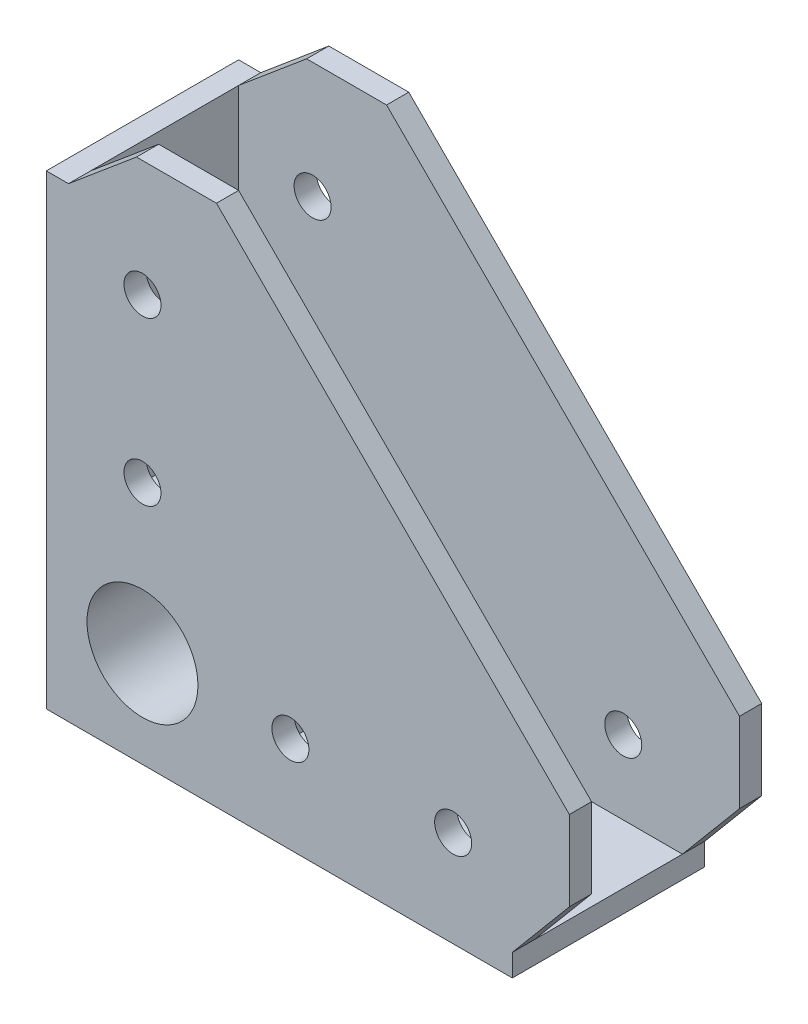
ISO-10303-21;
HEADER;
FILE_DESCRIPTION(('STEP AP214'),'2;1');
FILE_NAME('part.step','',(''),(''),'','','');
FILE_SCHEMA(('AUTOMOTIVE_DESIGN { 1 0 10303 214 1 1 1 1 }'));
ENDSEC;
DATA;
#1=APPLICATION_CONTEXT('core data for automotive mechanical design processes');
#2=APPLICATION_PROTOCOL_DEFINITION('international standard','automotive_design',2000,#1);
#3=PRODUCT_CONTEXT('',#1,'mechanical');
#4=PRODUCT('Part','Part','',(#3));
#5=PRODUCT_RELATED_PRODUCT_CATEGORY('part','',(#4));
#6=PRODUCT_DEFINITION_FORMATION('','',#4);
#7=PRODUCT_DEFINITION_CONTEXT('part definition',#1,'design');
#8=PRODUCT_DEFINITION('design','',#6,#7);
#9=PRODUCT_DEFINITION_SHAPE('','',#8);
#10=(LENGTH_UNIT() NAMED_UNIT(*) SI_UNIT(.MILLI.,.METRE.));
#11=(NAMED_UNIT(*) PLANE_ANGLE_UNIT() SI_UNIT($,.RADIAN.));
#12=(NAMED_UNIT(*) SI_UNIT($,.STERADIAN.) SOLID_ANGLE_UNIT());
#13=UNCERTAINTY_MEASURE_WITH_UNIT(LENGTH_MEASURE(1.E-05),#10,'distance_accuracy_value','');
#14=(GEOMETRIC_REPRESENTATION_CONTEXT(3) GLOBAL_UNCERTAINTY_ASSIGNED_CONTEXT((#13)) GLOBAL_UNIT_ASSIGNED_CONTEXT((#10,
#11,#12)) REPRESENTATION_CONTEXT('',''));
#15=CARTESIAN_POINT('',(0.,0.,0.));
#16=DIRECTION('',(0.,0.,1.));
#17=DIRECTION('',(1.,0.,0.));
#18=AXIS2_PLACEMENT_3D('',#15,#16,#17);
#19=CARTESIAN_POINT('',(9.99999999999999,10.,20.));
#20=DIRECTION('',(-1.,0.,0.));
#21=DIRECTION('',(0.,-1.,0.));
#22=AXIS2_PLACEMENT_3D('',#19,#20,#21);
#23=PLANE('',#22);
#24=DIRECTION('',(0.,1.,0.));
#25=VECTOR('',#24,1.);
#26=CARTESIAN_POINT('',(9.99999999999999,10.,0.));
#27=LINE('',#26,#25);
#28=CARTESIAN_POINT('',(9.99999999999999,-10.,0.));
#29=VERTEX_POINT('',#28);
#30=CARTESIAN_POINT('',(9.99999999999999,10.,0.));
#31=VERTEX_POINT('',#30);
#32=EDGE_CURVE('E350',#29,#31,#27,.T.);
#33=ORIENTED_EDGE('',*,*,#32,.T.);
#34=DIRECTION('',(0.,0.,-1.));
#35=VECTOR('',#34,1.);
#36=CARTESIAN_POINT('',(9.99999999999999,10.,20.));
#37=LINE('',#36,#35);
#38=CARTESIAN_POINT('',(9.99999999999999,10.,20.));
#39=VERTEX_POINT('',#38);
#40=EDGE_CURVE('E11',#39,#31,#37,.T.);
#41=ORIENTED_EDGE('',*,*,#40,.F.);
#42=DIRECTION('',(0.,1.,0.));
#43=VECTOR('',#42,1.);
#44=CARTESIAN_POINT('',(9.99999999999999,10.,20.));
#45=LINE('',#44,#43);
#46=CARTESIAN_POINT('',(10.,-10.,20.));
#47=VERTEX_POINT('',#46);
#48=EDGE_CURVE('E56',#47,#39,#45,.T.);
#49=ORIENTED_EDGE('',*,*,#48,.F.);
#50=DIRECTION('',(0.,0.,-1.));
#51=VECTOR('',#50,1.);
#52=CARTESIAN_POINT('',(10.,-10.,20.));
#53=LINE('',#52,#51);
#54=EDGE_CURVE('E357',#47,#29,#53,.T.);
#55=ORIENTED_EDGE('',*,*,#54,.T.);
#56=EDGE_LOOP('',(#33,#41,#49,#55));
#57=FACE_BOUND('',#56,.T.);
#58=ADVANCED_FACE('F38',(#57),#23,.F.);
#59=CARTESIAN_POINT('',(-10.,10.,20.));
#60=DIRECTION('',(0.,-1.,0.));
#61=DIRECTION('',(0.,0.,-1.));
#62=AXIS2_PLACEMENT_3D('',#59,#60,#61);
#63=PLANE('',#62);
#64=DIRECTION('',(-1.,0.,0.));
#65=VECTOR('',#64,1.);
#66=CARTESIAN_POINT('',(-10.,10.,0.));
#67=LINE('',#66,#65);
#68=CARTESIAN_POINT('',(-10.,10.,0.));
#69=VERTEX_POINT('',#68);
#70=EDGE_CURVE('E354',#31,#69,#67,.T.);
#71=ORIENTED_EDGE('',*,*,#70,.T.);
#72=DIRECTION('',(0.,0.,-1.));
#73=VECTOR('',#72,1.);
#74=CARTESIAN_POINT('',(-10.,10.,20.));
#75=LINE('',#74,#73);
#76=CARTESIAN_POINT('',(-10.,10.,20.));
#77=VERTEX_POINT('',#76);
#78=EDGE_CURVE('E48',#77,#69,#75,.T.);
#79=ORIENTED_EDGE('',*,*,#78,.F.);
#80=DIRECTION('',(-1.,0.,0.));
#81=VECTOR('',#80,1.);
#82=CARTESIAN_POINT('',(-10.,10.,20.));
#83=LINE('',#82,#81);
#84=EDGE_CURVE('E353',#39,#77,#83,.T.);
#85=ORIENTED_EDGE('',*,*,#84,.F.);
#86=ORIENTED_EDGE('',*,*,#40,.T.);
#87=EDGE_LOOP('',(#71,#79,#85,#86));
#88=FACE_BOUND('',#87,.T.);
#89=ADVANCED_FACE('F530',(#88),#63,.F.);
#90=CARTESIAN_POINT('',(0.,0.,20.));
#91=DIRECTION('',(0.,0.,1.));
#92=DIRECTION('',(1.,0.,0.));
#93=AXIS2_PLACEMENT_3D('',#90,#91,#92);
#94=PLANE('',#93);
#95=CARTESIAN_POINT('',(0.,42.,20.));
#96=DIRECTION('',(0.,0.,1.));
#97=DIRECTION('',(1.,0.,0.));
#98=AXIS2_PLACEMENT_3D('',#95,#96,#97);
#99=CIRCLE('',#98,2.5);
#100=CARTESIAN_POINT('',(2.5,42.,20.));
#101=VERTEX_POINT('',#100);
#102=EDGE_CURVE('E449',#101,#101,#99,.T.);
#103=ORIENTED_EDGE('',*,*,#102,.T.);
#104=EDGE_LOOP('',(#103));
#105=FACE_BOUND('',#104,.T.);
#106=CARTESIAN_POINT('',(0.,20.,20.));
#107=DIRECTION('',(0.,0.,1.));
#108=DIRECTION('',(1.,0.,0.));
#109=AXIS2_PLACEMENT_3D('',#106,#107,#108);
#110=CIRCLE('',#109,2.5);
#111=CARTESIAN_POINT('',(2.5,20.,20.));
#112=VERTEX_POINT('',#111);
#113=EDGE_CURVE('E437',#112,#112,#110,.T.);
#114=ORIENTED_EDGE('',*,*,#113,.T.);
#115=EDGE_LOOP('',(#114));
#116=FACE_BOUND('',#115,.T.);
#117=CARTESIAN_POINT('',(42.,0.,20.));
#118=DIRECTION('',(0.,0.,1.));
#119=DIRECTION('',(1.,0.,0.));
#120=AXIS2_PLACEMENT_3D('',#117,#118,#119);
#121=CIRCLE('',#120,2.5);
#122=CARTESIAN_POINT('',(44.5,0.,20.));
#123=VERTEX_POINT('',#122);
#124=EDGE_CURVE('E425',#123,#123,#121,.T.);
#125=ORIENTED_EDGE('',*,*,#124,.T.);
#126=EDGE_LOOP('',(#125));
#127=FACE_BOUND('',#126,.T.);
#128=CARTESIAN_POINT('',(20.,0.,20.));
#129=DIRECTION('',(0.,0.,1.));
#130=DIRECTION('',(1.,0.,0.));
#131=AXIS2_PLACEMENT_3D('',#128,#129,#130);
#132=CIRCLE('',#131,2.5);
#133=CARTESIAN_POINT('',(22.5,0.,20.));
#134=VERTEX_POINT('',#133);
#135=EDGE_CURVE('E413',#134,#134,#132,.T.);
#136=ORIENTED_EDGE('',*,*,#135,.T.);
#137=EDGE_LOOP('',(#136));
#138=FACE_BOUND('',#137,.T.);
#139=DIRECTION('',(1.,0.,0.));
#140=VECTOR('',#139,1.);
#141=CARTESIAN_POINT('',(10.,-10.,20.));
#142=LINE('',#141,#140);
#143=CARTESIAN_POINT('',(50.,-10.,20.));
#144=VERTEX_POINT('',#143);
#145=EDGE_CURVE('E287',#47,#144,#142,.T.);
#146=ORIENTED_EDGE('',*,*,#145,.F.);
#147=ORIENTED_EDGE('',*,*,#48,.T.);
#148=ORIENTED_EDGE('',*,*,#84,.T.);
#149=DIRECTION('',(0.,-1.,0.));
#150=VECTOR('',#149,1.);
#151=CARTESIAN_POINT('',(-10.,-10.,20.));
#152=LINE('',#151,#150);
#153=CARTESIAN_POINT('',(-10.,50.,20.));
#154=VERTEX_POINT('',#153);
#155=EDGE_CURVE('E292',#154,#77,#152,.T.);
#156=ORIENTED_EDGE('',*,*,#155,.F.);
#157=DIRECTION('',(-0.766044443118979,-0.642787609686538,0.));
#158=VECTOR('',#157,1.);
#159=CARTESIAN_POINT('',(-10.,50.,20.));
#160=LINE('',#159,#158);
#161=CARTESIAN_POINT('',(-0.807466682572253,57.7134513162384,20.));
#162=VERTEX_POINT('',#161);
#163=EDGE_CURVE('E320',#162,#154,#160,.T.);
#164=ORIENTED_EDGE('',*,*,#163,.F.);
#165=DIRECTION('',(-1.,0.,0.));
#166=VECTOR('',#165,1.);
#167=CARTESIAN_POINT('',(-0.807466682572253,57.7134513162384,20.));
#168=LINE('',#167,#166);
#169=CARTESIAN_POINT('',(10.,57.7134513162384,20.));
#170=VERTEX_POINT('',#169);
#171=EDGE_CURVE('E317',#170,#162,#168,.T.);
#172=ORIENTED_EDGE('',*,*,#171,.F.);
#173=DIRECTION('',(-0.707106781186548,0.707106781186548,0.));
#174=VECTOR('',#173,1.);
#175=CARTESIAN_POINT('',(10.,57.7134513162384,20.));
#176=LINE('',#175,#174);
#177=CARTESIAN_POINT('',(57.7134513162384,10.,20.));
#178=VERTEX_POINT('',#177);
#179=EDGE_CURVE('E314',#178,#170,#176,.T.);
#180=ORIENTED_EDGE('',*,*,#179,.F.);
#181=DIRECTION('',(0.,1.,0.));
#182=VECTOR('',#181,1.);
#183=CARTESIAN_POINT('',(57.7134513162384,-0.807466682572242,20.));
#184=LINE('',#183,#182);
#185=CARTESIAN_POINT('',(57.7134513162384,-0.807466682572242,20.));
#186=VERTEX_POINT('',#185);
#187=EDGE_CURVE('E311',#186,#178,#184,.T.);
#188=ORIENTED_EDGE('',*,*,#187,.F.);
#189=DIRECTION('',(0.642787609686537,0.76604444311898,0.));
#190=VECTOR('',#189,1.);
#191=CARTESIAN_POINT('',(50.,-10.,20.));
#192=LINE('',#191,#190);
#193=EDGE_CURVE('E308',#144,#186,#192,.T.);
#194=ORIENTED_EDGE('',*,*,#193,.F.);
#195=EDGE_LOOP('',(#146,#147,#148,#156,#164,#172,#180,#188,#194));
#196=FACE_BOUND('',#195,.T.);
#197=ADVANCED_FACE('F536',(#105,#116,#127,#138,#196),#94,.F.);
#198=CARTESIAN_POINT('',(50.,-10.,23.));
#199=DIRECTION('',(-0.76604444311898,0.642787609686537,0.));
#200=DIRECTION('',(-0.642787609686537,-0.76604444311898,0.));
#201=AXIS2_PLACEMENT_3D('',#198,#199,#200);
#202=PLANE('',#201);
#203=ORIENTED_EDGE('',*,*,#193,.T.);
#204=DIRECTION('',(0.,0.,-1.));
#205=VECTOR('',#204,1.);
#206=CARTESIAN_POINT('',(57.7134513162384,-0.807466682572242,23.));
#207=LINE('',#206,#205);
#208=CARTESIAN_POINT('',(57.7134513162384,-0.807466682572242,23.));
#209=VERTEX_POINT('',#208);
#210=EDGE_CURVE('E342',#209,#186,#207,.T.);
#211=ORIENTED_EDGE('',*,*,#210,.F.);
#212=DIRECTION('',(0.642787609686537,0.76604444311898,0.));
#213=VECTOR('',#212,1.);
#214=CARTESIAN_POINT('',(50.,-10.,23.));
#215=LINE('',#214,#213);
#216=CARTESIAN_POINT('',(50.,-10.,23.));
#217=VERTEX_POINT('',#216);
#218=EDGE_CURVE('E288',#217,#209,#215,.T.);
#219=ORIENTED_EDGE('',*,*,#218,.F.);
#220=DIRECTION('',(0.,0.,-1.));
#221=VECTOR('',#220,1.);
#222=CARTESIAN_POINT('',(50.,-10.,23.));
#223=LINE('',#222,#221);
#224=EDGE_CURVE('E346',#217,#144,#223,.T.);
#225=ORIENTED_EDGE('',*,*,#224,.T.);
#226=EDGE_LOOP('',(#203,#211,#219,#225));
#227=FACE_BOUND('',#226,.T.);
#228=ADVANCED_FACE('F507',(#227),#202,.F.);
#229=CARTESIAN_POINT('',(57.7134513162384,-0.807466682572242,23.));
#230=DIRECTION('',(-1.,0.,0.));
#231=DIRECTION('',(0.,0.,1.));
#232=AXIS2_PLACEMENT_3D('',#229,#230,#231);
#233=PLANE('',#232);
#234=ORIENTED_EDGE('',*,*,#187,.T.);
#235=DIRECTION('',(0.,0.,-1.));
#236=VECTOR('',#235,1.);
#237=CARTESIAN_POINT('',(57.7134513162384,10.,23.));
#238=LINE('',#237,#236);
#239=CARTESIAN_POINT('',(57.7134513162384,10.,23.));
#240=VERTEX_POINT('',#239);
#241=EDGE_CURVE('E338',#240,#178,#238,.T.);
#242=ORIENTED_EDGE('',*,*,#241,.F.);
#243=DIRECTION('',(0.,1.,0.));
#244=VECTOR('',#243,1.);
#245=CARTESIAN_POINT('',(57.7134513162384,-0.807466682572242,23.));
#246=LINE('',#245,#244);
#247=EDGE_CURVE('E291',#209,#240,#246,.T.);
#248=ORIENTED_EDGE('',*,*,#247,.F.);
#249=ORIENTED_EDGE('',*,*,#210,.T.);
#250=EDGE_LOOP('',(#234,#242,#248,#249));
#251=FACE_BOUND('',#250,.T.);
#252=ADVANCED_FACE('F510',(#251),#233,.F.);
#253=CARTESIAN_POINT('',(10.,57.7134513162384,23.));
#254=DIRECTION('',(-0.707106781186547,-0.707106781186548,0.));
#255=DIRECTION('',(0.707106781186548,-0.707106781186547,0.));
#256=AXIS2_PLACEMENT_3D('',#253,#254,#255);
#257=PLANE('',#256);
#258=ORIENTED_EDGE('',*,*,#179,.T.);
#259=DIRECTION('',(0.,0.,-1.));
#260=VECTOR('',#259,1.);
#261=CARTESIAN_POINT('',(10.,57.7134513162384,23.));
#262=LINE('',#261,#260);
#263=CARTESIAN_POINT('',(10.,57.7134513162384,23.));
#264=VERTEX_POINT('',#263);
#265=EDGE_CURVE('E334',#264,#170,#262,.T.);
#266=ORIENTED_EDGE('',*,*,#265,.F.);
#267=DIRECTION('',(-0.707106781186548,0.707106781186548,0.));
#268=VECTOR('',#267,1.);
#269=CARTESIAN_POINT('',(10.,57.7134513162384,23.));
#270=LINE('',#269,#268);
#271=EDGE_CURVE('E295',#240,#264,#270,.T.);
#272=ORIENTED_EDGE('',*,*,#271,.F.);
#273=ORIENTED_EDGE('',*,*,#241,.T.);
#274=EDGE_LOOP('',(#258,#266,#272,#273));
#275=FACE_BOUND('',#274,.T.);
#276=ADVANCED_FACE('F515',(#275),#257,.F.);
#277=CARTESIAN_POINT('',(-0.807466682572253,57.7134513162384,23.));
#278=DIRECTION('',(0.,-1.,0.));
#279=DIRECTION('',(0.,0.,-1.));
#280=AXIS2_PLACEMENT_3D('',#277,#278,#279);
#281=PLANE('',#280);
#282=ORIENTED_EDGE('',*,*,#171,.T.);
#283=DIRECTION('',(0.,0.,-1.));
#284=VECTOR('',#283,1.);
#285=CARTESIAN_POINT('',(-0.807466682572253,57.7134513162384,23.));
#286=LINE('',#285,#284);
#287=CARTESIAN_POINT('',(-0.807466682572253,57.7134513162384,23.));
#288=VERTEX_POINT('',#287);
#289=EDGE_CURVE('E330',#288,#162,#286,.T.);
#290=ORIENTED_EDGE('',*,*,#289,.F.);
#291=DIRECTION('',(-1.,0.,0.));
#292=VECTOR('',#291,1.);
#293=CARTESIAN_POINT('',(-0.807466682572253,57.7134513162384,23.));
#294=LINE('',#293,#292);
#295=EDGE_CURVE('E298',#264,#288,#294,.T.);
#296=ORIENTED_EDGE('',*,*,#295,.F.);
#297=ORIENTED_EDGE('',*,*,#265,.T.);
#298=EDGE_LOOP('',(#282,#290,#296,#297));
#299=FACE_BOUND('',#298,.T.);
#300=ADVANCED_FACE('F519',(#299),#281,.F.);
#301=CARTESIAN_POINT('',(-10.,50.,23.));
#302=DIRECTION('',(0.642787609686538,-0.766044443118979,0.));
#303=DIRECTION('',(0.766044443118979,0.642787609686538,0.));
#304=AXIS2_PLACEMENT_3D('',#301,#302,#303);
#305=PLANE('',#304);
#306=ORIENTED_EDGE('',*,*,#163,.T.);
#307=DIRECTION('',(0.,0.,-1.));
#308=VECTOR('',#307,1.);
#309=CARTESIAN_POINT('',(-10.,50.,23.));
#310=LINE('',#309,#308);
#311=CARTESIAN_POINT('',(-10.,50.,23.));
#312=VERTEX_POINT('',#311);
#313=EDGE_CURVE('E304',#312,#154,#310,.T.);
#314=ORIENTED_EDGE('',*,*,#313,.F.);
#315=DIRECTION('',(-0.766044443118979,-0.642787609686538,0.));
#316=VECTOR('',#315,1.);
#317=CARTESIAN_POINT('',(-10.,50.,23.));
#318=LINE('',#317,#316);
#319=EDGE_CURVE('E301',#288,#312,#318,.T.);
#320=ORIENTED_EDGE('',*,*,#319,.F.);
#321=ORIENTED_EDGE('',*,*,#289,.T.);
#322=EDGE_LOOP('',(#306,#314,#320,#321));
#323=FACE_BOUND('',#322,.T.);
#324=ADVANCED_FACE('F466',(#323),#305,.F.);
#325=CARTESIAN_POINT('',(0.,0.,23.));
#326=DIRECTION('',(0.,0.,1.));
#327=DIRECTION('',(1.,0.,0.));
#328=AXIS2_PLACEMENT_3D('',#325,#326,#327);
#329=PLANE('',#328);
#330=CARTESIAN_POINT('',(0.,42.,23.));
#331=DIRECTION('',(0.,0.,1.));
#332=DIRECTION('',(1.,0.,0.));
#333=AXIS2_PLACEMENT_3D('',#330,#331,#332);
#334=CIRCLE('',#333,2.5);
#335=CARTESIAN_POINT('',(2.5,42.,23.));
#336=VERTEX_POINT('',#335);
#337=EDGE_CURVE('E445',#336,#336,#334,.T.);
#338=ORIENTED_EDGE('',*,*,#337,.F.);
#339=EDGE_LOOP('',(#338));
#340=FACE_BOUND('',#339,.T.);
#341=CARTESIAN_POINT('',(0.,20.,23.));
#342=DIRECTION('',(0.,0.,1.));
#343=DIRECTION('',(1.,0.,0.));
#344=AXIS2_PLACEMENT_3D('',#341,#342,#343);
#345=CIRCLE('',#344,2.5);
#346=CARTESIAN_POINT('',(2.5,20.,23.));
#347=VERTEX_POINT('',#346);
#348=EDGE_CURVE('E433',#347,#347,#345,.T.);
#349=ORIENTED_EDGE('',*,*,#348,.F.);
#350=EDGE_LOOP('',(#349));
#351=FACE_BOUND('',#350,.T.);
#352=CARTESIAN_POINT('',(42.,0.,23.));
#353=DIRECTION('',(0.,0.,1.));
#354=DIRECTION('',(1.,0.,0.));
#355=AXIS2_PLACEMENT_3D('',#352,#353,#354);
#356=CIRCLE('',#355,2.5);
#357=CARTESIAN_POINT('',(44.5,0.,23.));
#358=VERTEX_POINT('',#357);
#359=EDGE_CURVE('E421',#358,#358,#356,.T.);
#360=ORIENTED_EDGE('',*,*,#359,.F.);
#361=EDGE_LOOP('',(#360));
#362=FACE_BOUND('',#361,.T.);
#363=CARTESIAN_POINT('',(20.,0.,23.));
#364=DIRECTION('',(0.,0.,1.));
#365=DIRECTION('',(1.,0.,0.));
#366=AXIS2_PLACEMENT_3D('',#363,#364,#365);
#367=CIRCLE('',#366,2.5);
#368=CARTESIAN_POINT('',(22.5,0.,23.));
#369=VERTEX_POINT('',#368);
#370=EDGE_CURVE('E409',#369,#369,#367,.T.);
#371=ORIENTED_EDGE('',*,*,#370,.F.);
#372=EDGE_LOOP('',(#371));
#373=FACE_BOUND('',#372,.T.);
#374=CARTESIAN_POINT('',(0.,0.,23.));
#375=DIRECTION('',(0.,0.,1.));
#376=DIRECTION('',(1.,0.,0.));
#377=AXIS2_PLACEMENT_3D('',#374,#375,#376);
#378=CIRCLE('',#377,7.5);
#379=CARTESIAN_POINT('',(7.5,0.,23.));
#380=VERTEX_POINT('',#379);
#381=EDGE_CURVE('E198',#380,#380,#378,.T.);
#382=ORIENTED_EDGE('',*,*,#381,.F.);
#383=EDGE_LOOP('',(#382));
#384=FACE_BOUND('',#383,.T.);
#385=DIRECTION('',(0.,1.,0.));
#386=VECTOR('',#385,1.);
#387=CARTESIAN_POINT('',(-13.,-10.,23.));
#388=LINE('',#387,#386);
#389=CARTESIAN_POINT('',(-13.,-13.,23.));
#390=VERTEX_POINT('',#389);
#391=CARTESIAN_POINT('',(-13.,50.,23.));
#392=VERTEX_POINT('',#391);
#393=EDGE_CURVE('E173',#390,#392,#388,.T.);
#394=ORIENTED_EDGE('',*,*,#393,.F.);
#395=DIRECTION('',(-1.,0.,0.));
#396=VECTOR('',#395,1.);
#397=CARTESIAN_POINT('',(-13.,-13.,23.));
#398=LINE('',#397,#396);
#399=CARTESIAN_POINT('',(50.,-13.,23.));
#400=VERTEX_POINT('',#399);
#401=EDGE_CURVE('E189',#400,#390,#398,.T.);
#402=ORIENTED_EDGE('',*,*,#401,.F.);
#403=DIRECTION('',(0.,1.,0.));
#404=VECTOR('',#403,1.);
#405=CARTESIAN_POINT('',(50.,-13.,23.));
#406=LINE('',#405,#404);
#407=EDGE_CURVE('E204',#400,#217,#406,.T.);
#408=ORIENTED_EDGE('',*,*,#407,.T.);
#409=ORIENTED_EDGE('',*,*,#218,.T.);
#410=ORIENTED_EDGE('',*,*,#247,.T.);
#411=ORIENTED_EDGE('',*,*,#271,.T.);
#412=ORIENTED_EDGE('',*,*,#295,.T.);
#413=ORIENTED_EDGE('',*,*,#319,.T.);
#414=DIRECTION('',(1.,0.,0.));
#415=VECTOR('',#414,1.);
#416=CARTESIAN_POINT('',(-13.,50.,23.));
#417=LINE('',#416,#415);
#418=EDGE_CURVE('E221',#392,#312,#417,.T.);
#419=ORIENTED_EDGE('',*,*,#418,.F.);
#420=EDGE_LOOP('',(#394,#402,#408,#409,#410,#411,#412,#413,#419));
#421=FACE_BOUND('',#420,.T.);
#422=ADVANCED_FACE('F462',(#340,#351,#362,#373,#384,#421),#329,.T.);
#423=CARTESIAN_POINT('',(0.,0.,0.));
#424=DIRECTION('',(0.,0.,1.));
#425=DIRECTION('',(1.,0.,0.));
#426=AXIS2_PLACEMENT_3D('',#423,#424,#425);
#427=PLANE('',#426);
#428=CARTESIAN_POINT('',(0.,42.,0.));
#429=DIRECTION('',(0.,0.,1.));
#430=DIRECTION('',(1.,0.,0.));
#431=AXIS2_PLACEMENT_3D('',#428,#429,#430);
#432=CIRCLE('',#431,2.5);
#433=CARTESIAN_POINT('',(2.5,42.,0.));
#434=VERTEX_POINT('',#433);
#435=EDGE_CURVE('E441',#434,#434,#432,.T.);
#436=ORIENTED_EDGE('',*,*,#435,.F.);
#437=EDGE_LOOP('',(#436));
#438=FACE_BOUND('',#437,.T.);
#439=CARTESIAN_POINT('',(0.,20.,0.));
#440=DIRECTION('',(0.,0.,1.));
#441=DIRECTION('',(1.,0.,0.));
#442=AXIS2_PLACEMENT_3D('',#439,#440,#441);
#443=CIRCLE('',#442,2.5);
#444=CARTESIAN_POINT('',(2.5,20.,0.));
#445=VERTEX_POINT('',#444);
#446=EDGE_CURVE('E429',#445,#445,#443,.T.);
#447=ORIENTED_EDGE('',*,*,#446,.F.);
#448=EDGE_LOOP('',(#447));
#449=FACE_BOUND('',#448,.T.);
#450=CARTESIAN_POINT('',(42.,0.,0.));
#451=DIRECTION('',(0.,0.,1.));
#452=DIRECTION('',(1.,0.,0.));
#453=AXIS2_PLACEMENT_3D('',#450,#451,#452);
#454=CIRCLE('',#453,2.5);
#455=CARTESIAN_POINT('',(44.5,0.,0.));
#456=VERTEX_POINT('',#455);
#457=EDGE_CURVE('E417',#456,#456,#454,.T.);
#458=ORIENTED_EDGE('',*,*,#457,.F.);
#459=EDGE_LOOP('',(#458));
#460=FACE_BOUND('',#459,.T.);
#461=CARTESIAN_POINT('',(20.,0.,0.));
#462=DIRECTION('',(0.,0.,1.));
#463=DIRECTION('',(1.,0.,0.));
#464=AXIS2_PLACEMENT_3D('',#461,#462,#463);
#465=CIRCLE('',#464,2.5);
#466=CARTESIAN_POINT('',(22.5,0.,0.));
#467=VERTEX_POINT('',#466);
#468=EDGE_CURVE('E405',#467,#467,#465,.T.);
#469=ORIENTED_EDGE('',*,*,#468,.F.);
#470=EDGE_LOOP('',(#469));
#471=FACE_BOUND('',#470,.T.);
#472=ORIENTED_EDGE('',*,*,#32,.F.);
#473=DIRECTION('',(-1.,0.,0.));
#474=VECTOR('',#473,1.);
#475=CARTESIAN_POINT('',(-10.,-10.,0.));
#476=LINE('',#475,#474);
#477=CARTESIAN_POINT('',(50.,-10.,0.));
#478=VERTEX_POINT('',#477);
#479=EDGE_CURVE('E230',#478,#29,#476,.T.);
#480=ORIENTED_EDGE('',*,*,#479,.F.);
#481=DIRECTION('',(-0.642787609686537,-0.76604444311898,0.));
#482=VECTOR('',#481,1.);
#483=CARTESIAN_POINT('',(50.,-10.,0.));
#484=LINE('',#483,#482);
#485=CARTESIAN_POINT('',(57.7134513162384,-0.807466682572242,0.));
#486=VERTEX_POINT('',#485);
#487=EDGE_CURVE('E258',#486,#478,#484,.T.);
#488=ORIENTED_EDGE('',*,*,#487,.F.);
#489=DIRECTION('',(0.,-1.,0.));
#490=VECTOR('',#489,1.);
#491=CARTESIAN_POINT('',(57.7134513162384,-0.807466682572242,0.));
#492=LINE('',#491,#490);
#493=CARTESIAN_POINT('',(57.7134513162384,10.,0.));
#494=VERTEX_POINT('',#493);
#495=EDGE_CURVE('E255',#494,#486,#492,.T.);
#496=ORIENTED_EDGE('',*,*,#495,.F.);
#497=DIRECTION('',(0.707106781186548,-0.707106781186548,0.));
#498=VECTOR('',#497,1.);
#499=CARTESIAN_POINT('',(57.7134513162384,10.,0.));
#500=LINE('',#499,#498);
#501=CARTESIAN_POINT('',(10.,57.7134513162384,0.));
#502=VERTEX_POINT('',#501);
#503=EDGE_CURVE('E252',#502,#494,#500,.T.);
#504=ORIENTED_EDGE('',*,*,#503,.F.);
#505=DIRECTION('',(1.,0.,0.));
#506=VECTOR('',#505,1.);
#507=CARTESIAN_POINT('',(10.,57.7134513162384,0.));
#508=LINE('',#507,#506);
#509=CARTESIAN_POINT('',(-0.807466682572253,57.7134513162384,0.));
#510=VERTEX_POINT('',#509);
#511=EDGE_CURVE('E249',#510,#502,#508,.T.);
#512=ORIENTED_EDGE('',*,*,#511,.F.);
#513=DIRECTION('',(0.766044443118979,0.642787609686538,0.));
#514=VECTOR('',#513,1.);
#515=CARTESIAN_POINT('',(-0.807466682572253,57.7134513162384,0.));
#516=LINE('',#515,#514);
#517=CARTESIAN_POINT('',(-10.,50.,0.));
#518=VERTEX_POINT('',#517);
#519=EDGE_CURVE('E246',#518,#510,#516,.T.);
#520=ORIENTED_EDGE('',*,*,#519,.F.);
#521=DIRECTION('',(0.,1.,0.));
#522=VECTOR('',#521,1.);
#523=CARTESIAN_POINT('',(-10.,50.,0.));
#524=LINE('',#523,#522);
#525=EDGE_CURVE('E225',#69,#518,#524,.T.);
#526=ORIENTED_EDGE('',*,*,#525,.F.);
#527=ORIENTED_EDGE('',*,*,#70,.F.);
#528=EDGE_LOOP('',(#472,#480,#488,#496,#504,#512,#520,#526,#527));
#529=FACE_BOUND('',#528,.T.);
#530=ADVANCED_FACE('F465',(#438,#449,#460,#471,#529),#427,.T.);
#531=CARTESIAN_POINT('',(-0.807466682572253,57.7134513162384,-3.));
#532=DIRECTION('',(0.642787609686538,-0.766044443118979,0.));
#533=DIRECTION('',(0.766044443118979,0.642787609686538,0.));
#534=AXIS2_PLACEMENT_3D('',#531,#532,#533);
#535=PLANE('',#534);
#536=ORIENTED_EDGE('',*,*,#519,.T.);
#537=DIRECTION('',(0.,0.,1.));
#538=VECTOR('',#537,1.);
#539=CARTESIAN_POINT('',(-0.807466682572253,57.7134513162384,-3.));
#540=LINE('',#539,#538);
#541=CARTESIAN_POINT('',(-0.807466682572253,57.7134513162384,-3.));
#542=VERTEX_POINT('',#541);
#543=EDGE_CURVE('E279',#542,#510,#540,.T.);
#544=ORIENTED_EDGE('',*,*,#543,.F.);
#545=DIRECTION('',(0.766044443118979,0.642787609686538,0.));
#546=VECTOR('',#545,1.);
#547=CARTESIAN_POINT('',(-0.807466682572253,57.7134513162384,-3.));
#548=LINE('',#547,#546);
#549=CARTESIAN_POINT('',(-10.,50.,-3.));
#550=VERTEX_POINT('',#549);
#551=EDGE_CURVE('E226',#550,#542,#548,.T.);
#552=ORIENTED_EDGE('',*,*,#551,.F.);
#553=DIRECTION('',(0.,0.,1.));
#554=VECTOR('',#553,1.);
#555=CARTESIAN_POINT('',(-10.,50.,-3.));
#556=LINE('',#555,#554);
#557=EDGE_CURVE('E283',#550,#518,#556,.T.);
#558=ORIENTED_EDGE('',*,*,#557,.T.);
#559=EDGE_LOOP('',(#536,#544,#552,#558));
#560=FACE_BOUND('',#559,.T.);
#561=ADVANCED_FACE('F479',(#560),#535,.F.);
#562=CARTESIAN_POINT('',(10.,57.7134513162384,-3.));
#563=DIRECTION('',(0.,-1.,0.));
#564=DIRECTION('',(0.,0.,-1.));
#565=AXIS2_PLACEMENT_3D('',#562,#563,#564);
#566=PLANE('',#565);
#567=ORIENTED_EDGE('',*,*,#511,.T.);
#568=DIRECTION('',(0.,0.,1.));
#569=VECTOR('',#568,1.);
#570=CARTESIAN_POINT('',(10.,57.7134513162384,-3.));
#571=LINE('',#570,#569);
#572=CARTESIAN_POINT('',(10.,57.7134513162384,-3.));
#573=VERTEX_POINT('',#572);
#574=EDGE_CURVE('E275',#573,#502,#571,.T.);
#575=ORIENTED_EDGE('',*,*,#574,.F.);
#576=DIRECTION('',(1.,0.,0.));
#577=VECTOR('',#576,1.);
#578=CARTESIAN_POINT('',(10.,57.7134513162384,-3.));
#579=LINE('',#578,#577);
#580=EDGE_CURVE('E229',#542,#573,#579,.T.);
#581=ORIENTED_EDGE('',*,*,#580,.F.);
#582=ORIENTED_EDGE('',*,*,#543,.T.);
#583=EDGE_LOOP('',(#567,#575,#581,#582));
#584=FACE_BOUND('',#583,.T.);
#585=ADVANCED_FACE('F482',(#584),#566,.F.);
#586=CARTESIAN_POINT('',(57.7134513162384,10.,-3.));
#587=DIRECTION('',(-0.707106781186547,-0.707106781186548,0.));
#588=DIRECTION('',(0.707106781186548,-0.707106781186547,0.));
#589=AXIS2_PLACEMENT_3D('',#586,#587,#588);
#590=PLANE('',#589);
#591=ORIENTED_EDGE('',*,*,#503,.T.);
#592=DIRECTION('',(0.,0.,1.));
#593=VECTOR('',#592,1.);
#594=CARTESIAN_POINT('',(57.7134513162384,10.,-3.));
#595=LINE('',#594,#593);
#596=CARTESIAN_POINT('',(57.7134513162384,10.,-3.));
#597=VERTEX_POINT('',#596);
#598=EDGE_CURVE('E271',#597,#494,#595,.T.);
#599=ORIENTED_EDGE('',*,*,#598,.F.);
#600=DIRECTION('',(0.707106781186548,-0.707106781186548,0.));
#601=VECTOR('',#600,1.);
#602=CARTESIAN_POINT('',(57.7134513162384,10.,-3.));
#603=LINE('',#602,#601);
#604=EDGE_CURVE('E233',#573,#597,#603,.T.);
#605=ORIENTED_EDGE('',*,*,#604,.F.);
#606=ORIENTED_EDGE('',*,*,#574,.T.);
#607=EDGE_LOOP('',(#591,#599,#605,#606));
#608=FACE_BOUND('',#607,.T.);
#609=ADVANCED_FACE('F487',(#608),#590,.F.);
#610=CARTESIAN_POINT('',(57.7134513162384,-0.807466682572242,-3.));
#611=DIRECTION('',(-1.,0.,0.));
#612=DIRECTION('',(0.,0.,1.));
#613=AXIS2_PLACEMENT_3D('',#610,#611,#612);
#614=PLANE('',#613);
#615=ORIENTED_EDGE('',*,*,#495,.T.);
#616=DIRECTION('',(0.,0.,1.));
#617=VECTOR('',#616,1.);
#618=CARTESIAN_POINT('',(57.7134513162384,-0.807466682572242,-3.));
#619=LINE('',#618,#617);
#620=CARTESIAN_POINT('',(57.7134513162384,-0.807466682572242,-3.));
#621=VERTEX_POINT('',#620);
#622=EDGE_CURVE('E267',#621,#486,#619,.T.);
#623=ORIENTED_EDGE('',*,*,#622,.F.);
#624=DIRECTION('',(0.,-1.,0.));
#625=VECTOR('',#624,1.);
#626=CARTESIAN_POINT('',(57.7134513162384,-0.807466682572242,-3.));
#627=LINE('',#626,#625);
#628=EDGE_CURVE('E236',#597,#621,#627,.T.);
#629=ORIENTED_EDGE('',*,*,#628,.F.);
#630=ORIENTED_EDGE('',*,*,#598,.T.);
#631=EDGE_LOOP('',(#615,#623,#629,#630));
#632=FACE_BOUND('',#631,.T.);
#633=ADVANCED_FACE('F493',(#632),#614,.F.);
#634=CARTESIAN_POINT('',(50.,-10.,-3.));
#635=DIRECTION('',(-0.76604444311898,0.642787609686537,0.));
#636=DIRECTION('',(-0.642787609686537,-0.76604444311898,0.));
#637=AXIS2_PLACEMENT_3D('',#634,#635,#636);
#638=PLANE('',#637);
#639=ORIENTED_EDGE('',*,*,#487,.T.);
#640=DIRECTION('',(0.,0.,1.));
#641=VECTOR('',#640,1.);
#642=CARTESIAN_POINT('',(50.,-10.,-3.));
#643=LINE('',#642,#641);
#644=CARTESIAN_POINT('',(50.,-10.,-3.));
#645=VERTEX_POINT('',#644);
#646=EDGE_CURVE('E242',#645,#478,#643,.T.);
#647=ORIENTED_EDGE('',*,*,#646,.F.);
#648=DIRECTION('',(-0.642787609686537,-0.76604444311898,0.));
#649=VECTOR('',#648,1.);
#650=CARTESIAN_POINT('',(50.,-10.,-3.));
#651=LINE('',#650,#649);
#652=EDGE_CURVE('E239',#621,#645,#651,.T.);
#653=ORIENTED_EDGE('',*,*,#652,.F.);
#654=ORIENTED_EDGE('',*,*,#622,.T.);
#655=EDGE_LOOP('',(#639,#647,#653,#654));
#656=FACE_BOUND('',#655,.T.);
#657=ADVANCED_FACE('F497',(#656),#638,.F.);
#658=CARTESIAN_POINT('',(0.,0.,-3.));
#659=DIRECTION('',(0.,0.,1.));
#660=DIRECTION('',(1.,0.,0.));
#661=AXIS2_PLACEMENT_3D('',#658,#659,#660);
#662=PLANE('',#661);
#663=CARTESIAN_POINT('',(0.,42.,-3.));
#664=DIRECTION('',(0.,0.,-1.));
#665=DIRECTION('',(-1.,0.,0.));
#666=AXIS2_PLACEMENT_3D('',#663,#664,#665);
#667=CIRCLE('',#666,2.5);
#668=CARTESIAN_POINT('',(-2.5,42.,-3.));
#669=VERTEX_POINT('',#668);
#670=EDGE_CURVE('E377',#669,#669,#667,.T.);
#671=ORIENTED_EDGE('',*,*,#670,.F.);
#672=EDGE_LOOP('',(#671));
#673=FACE_BOUND('',#672,.T.);
#674=CARTESIAN_POINT('',(0.,20.,-3.));
#675=DIRECTION('',(0.,0.,-1.));
#676=DIRECTION('',(-1.,0.,0.));
#677=AXIS2_PLACEMENT_3D('',#674,#675,#676);
#678=CIRCLE('',#677,2.5);
#679=CARTESIAN_POINT('',(-2.5,20.,-3.));
#680=VERTEX_POINT('',#679);
#681=EDGE_CURVE('E395',#680,#680,#678,.T.);
#682=ORIENTED_EDGE('',*,*,#681,.F.);
#683=EDGE_LOOP('',(#682));
#684=FACE_BOUND('',#683,.T.);
#685=CARTESIAN_POINT('',(42.,0.,-3.));
#686=DIRECTION('',(0.,0.,-1.));
#687=DIRECTION('',(-1.,0.,0.));
#688=AXIS2_PLACEMENT_3D('',#685,#686,#687);
#689=CIRCLE('',#688,2.5);
#690=CARTESIAN_POINT('',(39.5,0.,-3.));
#691=VERTEX_POINT('',#690);
#692=EDGE_CURVE('E390',#691,#691,#689,.T.);
#693=ORIENTED_EDGE('',*,*,#692,.F.);
#694=EDGE_LOOP('',(#693));
#695=FACE_BOUND('',#694,.T.);
#696=CARTESIAN_POINT('',(20.,0.,-3.));
#697=DIRECTION('',(0.,0.,-1.));
#698=DIRECTION('',(-1.,0.,0.));
#699=AXIS2_PLACEMENT_3D('',#696,#697,#698);
#700=CIRCLE('',#699,2.5);
#701=CARTESIAN_POINT('',(17.5,0.,-3.));
#702=VERTEX_POINT('',#701);
#703=EDGE_CURVE('E394',#702,#702,#700,.T.);
#704=ORIENTED_EDGE('',*,*,#703,.F.);
#705=EDGE_LOOP('',(#704));
#706=FACE_BOUND('',#705,.T.);
#707=CARTESIAN_POINT('',(0.,0.,-3.));
#708=DIRECTION('',(0.,0.,1.));
#709=DIRECTION('',(1.,0.,0.));
#710=AXIS2_PLACEMENT_3D('',#707,#708,#709);
#711=CIRCLE('',#710,7.5);
#712=CARTESIAN_POINT('',(7.5,0.,-3.));
#713=VERTEX_POINT('',#712);
#714=EDGE_CURVE('E195',#713,#713,#711,.T.);
#715=ORIENTED_EDGE('',*,*,#714,.T.);
#716=EDGE_LOOP('',(#715));
#717=FACE_BOUND('',#716,.T.);
#718=ORIENTED_EDGE('',*,*,#652,.T.);
#719=DIRECTION('',(0.,1.,0.));
#720=VECTOR('',#719,1.);
#721=CARTESIAN_POINT('',(50.,-13.,-3.));
#722=LINE('',#721,#720);
#723=CARTESIAN_POINT('',(50.,-13.,-3.));
#724=VERTEX_POINT('',#723);
#725=EDGE_CURVE('E180',#724,#645,#722,.T.);
#726=ORIENTED_EDGE('',*,*,#725,.F.);
#727=DIRECTION('',(1.,0.,0.));
#728=VECTOR('',#727,1.);
#729=CARTESIAN_POINT('',(50.,-13.,-3.));
#730=LINE('',#729,#728);
#731=CARTESIAN_POINT('',(-13.,-13.,-3.));
#732=VERTEX_POINT('',#731);
#733=EDGE_CURVE('E177',#732,#724,#730,.T.);
#734=ORIENTED_EDGE('',*,*,#733,.F.);
#735=DIRECTION('',(0.,-1.,0.));
#736=VECTOR('',#735,1.);
#737=CARTESIAN_POINT('',(-13.,50.,-3.));
#738=LINE('',#737,#736);
#739=CARTESIAN_POINT('',(-13.,50.,-3.));
#740=VERTEX_POINT('',#739);
#741=EDGE_CURVE('E162',#740,#732,#738,.T.);
#742=ORIENTED_EDGE('',*,*,#741,.F.);
#743=DIRECTION('',(1.,0.,0.));
#744=VECTOR('',#743,1.);
#745=CARTESIAN_POINT('',(-13.,50.,-3.));
#746=LINE('',#745,#744);
#747=EDGE_CURVE('E215',#740,#550,#746,.T.);
#748=ORIENTED_EDGE('',*,*,#747,.T.);
#749=ORIENTED_EDGE('',*,*,#551,.T.);
#750=ORIENTED_EDGE('',*,*,#580,.T.);
#751=ORIENTED_EDGE('',*,*,#604,.T.);
#752=ORIENTED_EDGE('',*,*,#628,.T.);
#753=EDGE_LOOP('',(#718,#726,#734,#742,#748,#749,#750,#751,#752));
#754=FACE_BOUND('',#753,.T.);
#755=ADVANCED_FACE('F178',(#673,#684,#695,#706,#717,#754),#662,.F.);
#756=CARTESIAN_POINT('',(-10.,0.,0.));
#757=DIRECTION('',(-1.,0.,0.));
#758=DIRECTION('',(0.,-1.,0.));
#759=AXIS2_PLACEMENT_3D('',#756,#757,#758);
#760=PLANE('',#759);
#761=CARTESIAN_POINT('',(-10.,20.,10.));
#762=DIRECTION('',(1.,0.,0.));
#763=DIRECTION('',(0.,1.,0.));
#764=AXIS2_PLACEMENT_3D('',#761,#762,#763);
#765=CIRCLE('',#764,1.92465832422712);
#766=CARTESIAN_POINT('',(-10.,21.9246583242271,10.));
#767=VERTEX_POINT('',#766);
#768=EDGE_CURVE('E371',#767,#767,#765,.T.);
#769=ORIENTED_EDGE('',*,*,#768,.F.);
#770=EDGE_LOOP('',(#769));
#771=FACE_BOUND('',#770,.T.);
#772=CARTESIAN_POINT('',(-10.,42.,10.));
#773=DIRECTION('',(1.,0.,0.));
#774=DIRECTION('',(0.,1.,0.));
#775=AXIS2_PLACEMENT_3D('',#772,#773,#774);
#776=CIRCLE('',#775,2.22372332891516);
#777=CARTESIAN_POINT('',(-10.,44.2237233289152,10.));
#778=VERTEX_POINT('',#777);
#779=EDGE_CURVE('E379',#778,#778,#776,.T.);
#780=ORIENTED_EDGE('',*,*,#779,.F.);
#781=EDGE_LOOP('',(#780));
#782=FACE_BOUND('',#781,.T.);
#783=ORIENTED_EDGE('',*,*,#78,.T.);
#784=ORIENTED_EDGE('',*,*,#525,.T.);
#785=DIRECTION('',(0.,0.,-1.));
#786=VECTOR('',#785,1.);
#787=CARTESIAN_POINT('',(-10.,50.,23.));
#788=LINE('',#787,#786);
#789=EDGE_CURVE('E174',#154,#518,#788,.T.);
#790=ORIENTED_EDGE('',*,*,#789,.F.);
#791=ORIENTED_EDGE('',*,*,#155,.T.);
#792=EDGE_LOOP('',(#783,#784,#790,#791));
#793=FACE_BOUND('',#792,.T.);
#794=ADVANCED_FACE('F525',(#771,#782,#793),#760,.F.);
#795=CARTESIAN_POINT('',(-13.,50.,23.));
#796=DIRECTION('',(0.,-1.,0.));
#797=DIRECTION('',(1.,0.,0.));
#798=AXIS2_PLACEMENT_3D('',#795,#796,#797);
#799=PLANE('',#798);
#800=ORIENTED_EDGE('',*,*,#313,.T.);
#801=ORIENTED_EDGE('',*,*,#789,.T.);
#802=ORIENTED_EDGE('',*,*,#557,.F.);
#803=ORIENTED_EDGE('',*,*,#747,.F.);
#804=DIRECTION('',(0.,0.,-1.));
#805=VECTOR('',#804,1.);
#806=CARTESIAN_POINT('',(-13.,50.,23.));
#807=LINE('',#806,#805);
#808=EDGE_CURVE('E168',#392,#740,#807,.T.);
#809=ORIENTED_EDGE('',*,*,#808,.F.);
#810=ORIENTED_EDGE('',*,*,#418,.T.);
#811=EDGE_LOOP('',(#800,#801,#802,#803,#809,#810));
#812=FACE_BOUND('',#811,.T.);
#813=ADVANCED_FACE('F473',(#812),#799,.F.);
#814=CARTESIAN_POINT('',(-13.,0.,0.));
#815=DIRECTION('',(-1.,0.,0.));
#816=DIRECTION('',(0.,-1.,0.));
#817=AXIS2_PLACEMENT_3D('',#814,#815,#816);
#818=PLANE('',#817);
#819=CARTESIAN_POINT('',(-13.,20.,10.));
#820=DIRECTION('',(-1.,0.,0.));
#821=DIRECTION('',(0.,-1.,0.));
#822=AXIS2_PLACEMENT_3D('',#819,#820,#821);
#823=CIRCLE('',#822,1.92465832422712);
#824=CARTESIAN_POINT('',(-13.,18.0753416757729,10.));
#825=VERTEX_POINT('',#824);
#826=EDGE_CURVE('E41',#825,#825,#823,.T.);
#827=ORIENTED_EDGE('',*,*,#826,.F.);
#828=EDGE_LOOP('',(#827));
#829=FACE_BOUND('',#828,.T.);
#830=CARTESIAN_POINT('',(-13.,42.,10.));
#831=DIRECTION('',(-1.,0.,0.));
#832=DIRECTION('',(0.,-1.,0.));
#833=AXIS2_PLACEMENT_3D('',#830,#831,#832);
#834=CIRCLE('',#833,2.22372332891516);
#835=CARTESIAN_POINT('',(-13.,39.7762766710848,10.));
#836=VERTEX_POINT('',#835);
#837=EDGE_CURVE('E368',#836,#836,#834,.T.);
#838=ORIENTED_EDGE('',*,*,#837,.F.);
#839=EDGE_LOOP('',(#838));
#840=FACE_BOUND('',#839,.T.);
#841=ORIENTED_EDGE('',*,*,#741,.T.);
#842=DIRECTION('',(0.,0.,-1.));
#843=VECTOR('',#842,1.);
#844=CARTESIAN_POINT('',(-13.,-13.,-3.));
#845=LINE('',#844,#843);
#846=EDGE_CURVE('E166',#390,#732,#845,.T.);
#847=ORIENTED_EDGE('',*,*,#846,.F.);
#848=ORIENTED_EDGE('',*,*,#393,.T.);
#849=ORIENTED_EDGE('',*,*,#808,.T.);
#850=EDGE_LOOP('',(#841,#847,#848,#849));
#851=FACE_BOUND('',#850,.T.);
#852=ADVANCED_FACE('F164',(#829,#840,#851),#818,.T.);
#853=CARTESIAN_POINT('',(50.,-13.,23.));
#854=DIRECTION('',(-1.,0.,0.));
#855=DIRECTION('',(0.,0.,1.));
#856=AXIS2_PLACEMENT_3D('',#853,#854,#855);
#857=PLANE('',#856);
#858=ORIENTED_EDGE('',*,*,#646,.T.);
#859=DIRECTION('',(0.,0.,1.));
#860=VECTOR('',#859,1.);
#861=CARTESIAN_POINT('',(50.,-10.,23.));
#862=LINE('',#861,#860);
#863=EDGE_CURVE('E191',#478,#144,#862,.T.);
#864=ORIENTED_EDGE('',*,*,#863,.T.);
#865=ORIENTED_EDGE('',*,*,#224,.F.);
#866=ORIENTED_EDGE('',*,*,#407,.F.);
#867=DIRECTION('',(0.,0.,1.));
#868=VECTOR('',#867,1.);
#869=CARTESIAN_POINT('',(50.,-13.,23.));
#870=LINE('',#869,#868);
#871=EDGE_CURVE('E184',#724,#400,#870,.T.);
#872=ORIENTED_EDGE('',*,*,#871,.F.);
#873=ORIENTED_EDGE('',*,*,#725,.T.);
#874=EDGE_LOOP('',(#858,#864,#865,#866,#872,#873));
#875=FACE_BOUND('',#874,.T.);
#876=ADVANCED_FACE('F500',(#875),#857,.F.);
#877=CARTESIAN_POINT('',(0.,-13.,0.));
#878=DIRECTION('',(0.,1.,0.));
#879=DIRECTION('',(0.,0.,1.));
#880=AXIS2_PLACEMENT_3D('',#877,#878,#879);
#881=PLANE('',#880);
#882=CARTESIAN_POINT('',(20.,-13.,10.));
#883=DIRECTION('',(0.,1.,0.));
#884=DIRECTION('',(0.,0.,1.));
#885=AXIS2_PLACEMENT_3D('',#882,#883,#884);
#886=CIRCLE('',#885,1.7946058217294);
#887=CARTESIAN_POINT('',(20.,-13.,11.7946058217294));
#888=VERTEX_POINT('',#887);
#889=EDGE_CURVE('E385',#888,#888,#886,.T.);
#890=ORIENTED_EDGE('',*,*,#889,.T.);
#891=EDGE_LOOP('',(#890));
#892=FACE_BOUND('',#891,.T.);
#893=CARTESIAN_POINT('',(42.,-13.,10.));
#894=DIRECTION('',(0.,1.,0.));
#895=DIRECTION('',(0.,0.,1.));
#896=AXIS2_PLACEMENT_3D('',#893,#894,#895);
#897=CIRCLE('',#896,1.81642996163262);
#898=CARTESIAN_POINT('',(42.,-13.,11.8164299616326));
#899=VERTEX_POINT('',#898);
#900=EDGE_CURVE('E824',#899,#899,#897,.T.);
#901=ORIENTED_EDGE('',*,*,#900,.T.);
#902=EDGE_LOOP('',(#901));
#903=FACE_BOUND('',#902,.T.);
#904=ORIENTED_EDGE('',*,*,#846,.T.);
#905=ORIENTED_EDGE('',*,*,#733,.T.);
#906=ORIENTED_EDGE('',*,*,#871,.T.);
#907=ORIENTED_EDGE('',*,*,#401,.T.);
#908=EDGE_LOOP('',(#904,#905,#906,#907));
#909=FACE_BOUND('',#908,.T.);
#910=ADVANCED_FACE('F187',(#892,#903,#909),#881,.F.);
#911=CARTESIAN_POINT('',(0.,-10.,0.));
#912=DIRECTION('',(0.,1.,0.));
#913=DIRECTION('',(0.,0.,1.));
#914=AXIS2_PLACEMENT_3D('',#911,#912,#913);
#915=PLANE('',#914);
#916=CARTESIAN_POINT('',(20.,-10.,10.));
#917=DIRECTION('',(0.,1.,0.));
#918=DIRECTION('',(0.,0.,1.));
#919=AXIS2_PLACEMENT_3D('',#916,#917,#918);
#920=CIRCLE('',#919,1.7946058217294);
#921=CARTESIAN_POINT('',(20.,-10.,11.7946058217294));
#922=VERTEX_POINT('',#921);
#923=EDGE_CURVE('E820',#922,#922,#920,.T.);
#924=ORIENTED_EDGE('',*,*,#923,.F.);
#925=EDGE_LOOP('',(#924));
#926=FACE_BOUND('',#925,.T.);
#927=CARTESIAN_POINT('',(42.,-10.,10.));
#928=DIRECTION('',(0.,1.,0.));
#929=DIRECTION('',(0.,0.,1.));
#930=AXIS2_PLACEMENT_3D('',#927,#928,#929);
#931=CIRCLE('',#930,1.81642996163262);
#932=CARTESIAN_POINT('',(42.,-10.,11.8164299616326));
#933=VERTEX_POINT('',#932);
#934=EDGE_CURVE('E830',#933,#933,#931,.T.);
#935=ORIENTED_EDGE('',*,*,#934,.F.);
#936=EDGE_LOOP('',(#935));
#937=FACE_BOUND('',#936,.T.);
#938=ORIENTED_EDGE('',*,*,#863,.F.);
#939=ORIENTED_EDGE('',*,*,#479,.T.);
#940=ORIENTED_EDGE('',*,*,#54,.F.);
#941=ORIENTED_EDGE('',*,*,#145,.T.);
#942=EDGE_LOOP('',(#938,#939,#940,#941));
#943=FACE_BOUND('',#942,.T.);
#944=ADVANCED_FACE('F534',(#926,#937,#943),#915,.T.);
#945=CARTESIAN_POINT('',(0.,0.,-3.));
#946=DIRECTION('',(0.,0.,1.));
#947=DIRECTION('',(1.,0.,0.));
#948=AXIS2_PLACEMENT_3D('',#945,#946,#947);
#949=CYLINDRICAL_SURFACE('',#948,7.5);
#950=CARTESIAN_POINT('',(7.5,0.,-3.));
#951=CARTESIAN_POINT('',(7.5,0.,-2.72916666666667));
#952=CARTESIAN_POINT('',(7.5,0.,-2.45833333333333));
#953=CARTESIAN_POINT('',(7.5,0.,-1.91666666666667));
#954=CARTESIAN_POINT('',(7.5,0.,-1.64583333333333));
#955=CARTESIAN_POINT('',(7.5,0.,-1.10416666666667));
#956=CARTESIAN_POINT('',(7.5,0.,-0.833333333333333));
#957=CARTESIAN_POINT('',(7.5,0.,-0.291666666666666));
#958=CARTESIAN_POINT('',(7.5,0.,-0.0208333333333326));
#959=CARTESIAN_POINT('',(7.5,0.,0.520833333333334));
#960=CARTESIAN_POINT('',(7.5,0.,0.791666666666667));
#961=CARTESIAN_POINT('',(7.5,0.,1.33333333333333));
#962=CARTESIAN_POINT('',(7.5,0.,1.60416666666667));
#963=CARTESIAN_POINT('',(7.5,0.,2.14583333333333));
#964=CARTESIAN_POINT('',(7.5,0.,2.41666666666667));
#965=CARTESIAN_POINT('',(7.5,0.,2.95833333333333));
#966=CARTESIAN_POINT('',(7.5,0.,3.22916666666667));
#967=CARTESIAN_POINT('',(7.5,0.,3.77083333333333));
#968=CARTESIAN_POINT('',(7.5,0.,4.04166666666667));
#969=CARTESIAN_POINT('',(7.5,0.,4.58333333333333));
#970=CARTESIAN_POINT('',(7.5,0.,4.85416666666667));
#971=CARTESIAN_POINT('',(7.5,0.,5.39583333333333));
#972=CARTESIAN_POINT('',(7.5,0.,5.66666666666667));
#973=CARTESIAN_POINT('',(7.5,0.,6.20833333333333));
#974=CARTESIAN_POINT('',(7.5,0.,6.47916666666667));
#975=CARTESIAN_POINT('',(7.5,0.,7.02083333333333));
#976=CARTESIAN_POINT('',(7.5,0.,7.29166666666667));
#977=CARTESIAN_POINT('',(7.5,0.,7.83333333333333));
#978=CARTESIAN_POINT('',(7.5,0.,8.10416666666667));
#979=CARTESIAN_POINT('',(7.5,0.,8.64583333333333));
#980=CARTESIAN_POINT('',(7.5,0.,8.91666666666667));
#981=CARTESIAN_POINT('',(7.5,0.,9.45833333333333));
#982=CARTESIAN_POINT('',(7.5,0.,9.72916666666667));
#983=CARTESIAN_POINT('',(7.5,0.,10.2708333333333));
#984=CARTESIAN_POINT('',(7.5,0.,10.5416666666667));
#985=CARTESIAN_POINT('',(7.5,0.,11.0833333333333));
#986=CARTESIAN_POINT('',(7.5,0.,11.3541666666667));
#987=CARTESIAN_POINT('',(7.5,0.,11.8958333333333));
#988=CARTESIAN_POINT('',(7.5,0.,12.1666666666667));
#989=CARTESIAN_POINT('',(7.5,0.,12.7083333333333));
#990=CARTESIAN_POINT('',(7.5,0.,12.9791666666667));
#991=CARTESIAN_POINT('',(7.5,0.,13.5208333333333));
#992=CARTESIAN_POINT('',(7.5,0.,13.7916666666667));
#993=CARTESIAN_POINT('',(7.5,0.,14.3333333333333));
#994=CARTESIAN_POINT('',(7.5,0.,14.6041666666667));
#995=CARTESIAN_POINT('',(7.5,0.,15.1458333333333));
#996=CARTESIAN_POINT('',(7.5,0.,15.4166666666667));
#997=CARTESIAN_POINT('',(7.5,0.,15.9583333333333));
#998=CARTESIAN_POINT('',(7.5,0.,16.2291666666667));
#999=CARTESIAN_POINT('',(7.5,0.,16.7708333333333));
#1000=CARTESIAN_POINT('',(7.5,0.,17.0416666666667));
#1001=CARTESIAN_POINT('',(7.5,0.,17.5833333333333));
#1002=CARTESIAN_POINT('',(7.5,0.,17.8541666666667));
#1003=CARTESIAN_POINT('',(7.5,0.,18.3958333333333));
#1004=CARTESIAN_POINT('',(7.5,0.,18.6666666666667));
#1005=CARTESIAN_POINT('',(7.5,0.,19.2083333333333));
#1006=CARTESIAN_POINT('',(7.5,0.,19.4791666666667));
#1007=CARTESIAN_POINT('',(7.5,0.,20.0208333333333));
#1008=CARTESIAN_POINT('',(7.5,0.,20.2916666666667));
#1009=CARTESIAN_POINT('',(7.5,0.,20.8333333333333));
#1010=CARTESIAN_POINT('',(7.5,0.,21.1041666666667));
#1011=CARTESIAN_POINT('',(7.5,0.,21.6458333333333));
#1012=CARTESIAN_POINT('',(7.5,0.,21.9166666666667));
#1013=CARTESIAN_POINT('',(7.5,0.,22.4583333333333));
#1014=CARTESIAN_POINT('',(7.5,0.,22.7291666666667));
#1015=CARTESIAN_POINT('',(7.5,0.,23.));
#1016=B_SPLINE_CURVE_WITH_KNOTS('',3,(#950,#951,#952,#953,#954,#955,#956,#957,#958,#959,#960,
#961,#962,#963,#964,#965,#966,#967,#968,#969,#970,#971,#972,#973,#974,#975,#976,#977,#978,#979,
#980,#981,#982,#983,#984,#985,#986,#987,#988,#989,#990,#991,#992,#993,#994,#995,#996,#997,#998,
#999,#1000,#1001,#1002,#1003,#1004,#1005,#1006,#1007,#1008,#1009,#1010,#1011,#1012,#1013,#1014,
#1015),.UNSPECIFIED.,.F.,.F.,(4,2,2,2,2,2,2,2,2,2,2,2,2,2,2,2,2,2,2,2,2,2,2,2,2,2,2,2,2,2,2,2,
4),(0.,0.8125,1.625,2.4375,3.25,4.0625,4.875,5.6875,6.5,7.3125,8.125,8.9375,9.75,10.5625,11.375,
12.1875,13.,13.8125,14.625,15.4375,16.25,17.0625,17.875,18.6875,19.5,20.3125,21.125,21.9375,
22.75,23.5625,24.375,25.1875,26.),.UNSPECIFIED.);
#1017=EDGE_CURVE('BSEAM460',#713,#380,#1016,.T.);
#1018=ORIENTED_EDGE('',*,*,#714,.F.);
#1019=ORIENTED_EDGE('',*,*,#381,.T.);
#1020=ORIENTED_EDGE('',*,*,#1017,.T.);
#1021=ORIENTED_EDGE('',*,*,#1017,.F.);
#1022=EDGE_LOOP('',(#1018,#1020,#1019,#1021));
#1023=FACE_BOUND('',#1022,.T.);
#1024=ADVANCED_FACE('F460',(#1023),#949,.F.);
#1025=CARTESIAN_POINT('',(20.,0.,47.));
#1026=DIRECTION('',(0.,0.,-1.));
#1027=DIRECTION('',(-1.,0.,0.));
#1028=AXIS2_PLACEMENT_3D('',#1025,#1026,#1027);
#1029=CYLINDRICAL_SURFACE('',#1028,2.5);
#1030=ORIENTED_EDGE('',*,*,#468,.T.);
#1031=EDGE_LOOP('',(#1030));
#1032=FACE_BOUND('',#1031,.T.);
#1033=ORIENTED_EDGE('',*,*,#703,.T.);
#1034=EDGE_LOOP('',(#1033));
#1035=FACE_BOUND('',#1034,.T.);
#1036=ADVANCED_FACE('F703',(#1032,#1035),#1029,.F.);
#1037=CARTESIAN_POINT('',(42.,0.,47.));
#1038=DIRECTION('',(0.,0.,-1.));
#1039=DIRECTION('',(-1.,0.,0.));
#1040=AXIS2_PLACEMENT_3D('',#1037,#1038,#1039);
#1041=CYLINDRICAL_SURFACE('',#1040,2.5);
#1042=ORIENTED_EDGE('',*,*,#457,.T.);
#1043=EDGE_LOOP('',(#1042));
#1044=FACE_BOUND('',#1043,.T.);
#1045=ORIENTED_EDGE('',*,*,#692,.T.);
#1046=EDGE_LOOP('',(#1045));
#1047=FACE_BOUND('',#1046,.T.);
#1048=ADVANCED_FACE('F709',(#1044,#1047),#1041,.F.);
#1049=CARTESIAN_POINT('',(0.,20.,47.));
#1050=DIRECTION('',(0.,0.,-1.));
#1051=DIRECTION('',(-1.,0.,0.));
#1052=AXIS2_PLACEMENT_3D('',#1049,#1050,#1051);
#1053=CYLINDRICAL_SURFACE('',#1052,2.5);
#1054=ORIENTED_EDGE('',*,*,#446,.T.);
#1055=EDGE_LOOP('',(#1054));
#1056=FACE_BOUND('',#1055,.T.);
#1057=ORIENTED_EDGE('',*,*,#681,.T.);
#1058=EDGE_LOOP('',(#1057));
#1059=FACE_BOUND('',#1058,.T.);
#1060=ADVANCED_FACE('F718',(#1056,#1059),#1053,.F.);
#1061=CARTESIAN_POINT('',(0.,42.,47.));
#1062=DIRECTION('',(0.,0.,-1.));
#1063=DIRECTION('',(-1.,0.,0.));
#1064=AXIS2_PLACEMENT_3D('',#1061,#1062,#1063);
#1065=CYLINDRICAL_SURFACE('',#1064,2.5);
#1066=ORIENTED_EDGE('',*,*,#435,.T.);
#1067=EDGE_LOOP('',(#1066));
#1068=FACE_BOUND('',#1067,.T.);
#1069=ORIENTED_EDGE('',*,*,#670,.T.);
#1070=EDGE_LOOP('',(#1069));
#1071=FACE_BOUND('',#1070,.T.);
#1072=ADVANCED_FACE('F727',(#1068,#1071),#1065,.F.);
#1073=ORIENTED_EDGE('',*,*,#370,.T.);
#1074=EDGE_LOOP('',(#1073));
#1075=FACE_BOUND('',#1074,.T.);
#1076=ORIENTED_EDGE('',*,*,#135,.F.);
#1077=EDGE_LOOP('',(#1076));
#1078=FACE_BOUND('',#1077,.T.);
#1079=ADVANCED_FACE('F712',(#1075,#1078),#1029,.F.);
#1080=ORIENTED_EDGE('',*,*,#359,.T.);
#1081=EDGE_LOOP('',(#1080));
#1082=FACE_BOUND('',#1081,.T.);
#1083=ORIENTED_EDGE('',*,*,#124,.F.);
#1084=EDGE_LOOP('',(#1083));
#1085=FACE_BOUND('',#1084,.T.);
#1086=ADVANCED_FACE('F721',(#1082,#1085),#1041,.F.);
#1087=ORIENTED_EDGE('',*,*,#348,.T.);
#1088=EDGE_LOOP('',(#1087));
#1089=FACE_BOUND('',#1088,.T.);
#1090=ORIENTED_EDGE('',*,*,#113,.F.);
#1091=EDGE_LOOP('',(#1090));
#1092=FACE_BOUND('',#1091,.T.);
#1093=ADVANCED_FACE('F730',(#1089,#1092),#1053,.F.);
#1094=ORIENTED_EDGE('',*,*,#337,.T.);
#1095=EDGE_LOOP('',(#1094));
#1096=FACE_BOUND('',#1095,.T.);
#1097=ORIENTED_EDGE('',*,*,#102,.F.);
#1098=EDGE_LOOP('',(#1097));
#1099=FACE_BOUND('',#1098,.T.);
#1100=ADVANCED_FACE('F738',(#1096,#1099),#1065,.F.);
#1101=CARTESIAN_POINT('',(-60.,42.,10.));
#1102=DIRECTION('',(1.,0.,0.));
#1103=DIRECTION('',(0.,1.,0.));
#1104=AXIS2_PLACEMENT_3D('',#1101,#1102,#1103);
#1105=CYLINDRICAL_SURFACE('',#1104,2.22372332891516);
#1106=ORIENTED_EDGE('',*,*,#837,.T.);
#1107=EDGE_LOOP('',(#1106));
#1108=FACE_BOUND('',#1107,.T.);
#1109=ORIENTED_EDGE('',*,*,#779,.T.);
#1110=EDGE_LOOP('',(#1109));
#1111=FACE_BOUND('',#1110,.T.);
#1112=ADVANCED_FACE('F761',(#1108,#1111),#1105,.F.);
#1113=CARTESIAN_POINT('',(-60.,20.,10.));
#1114=DIRECTION('',(1.,0.,0.));
#1115=DIRECTION('',(0.,1.,0.));
#1116=AXIS2_PLACEMENT_3D('',#1113,#1114,#1115);
#1117=CYLINDRICAL_SURFACE('',#1116,1.92465832422712);
#1118=ORIENTED_EDGE('',*,*,#826,.T.);
#1119=EDGE_LOOP('',(#1118));
#1120=FACE_BOUND('',#1119,.T.);
#1121=ORIENTED_EDGE('',*,*,#768,.T.);
#1122=EDGE_LOOP('',(#1121));
#1123=FACE_BOUND('',#1122,.T.);
#1124=ADVANCED_FACE('F767',(#1120,#1123),#1117,.F.);
#1125=CARTESIAN_POINT('',(42.,-60.,10.));
#1126=DIRECTION('',(0.,1.,0.));
#1127=DIRECTION('',(0.,0.,1.));
#1128=AXIS2_PLACEMENT_3D('',#1125,#1126,#1127);
#1129=CYLINDRICAL_SURFACE('',#1128,1.81642996163262);
#1130=ORIENTED_EDGE('',*,*,#934,.T.);
#1131=EDGE_LOOP('',(#1130));
#1132=FACE_BOUND('',#1131,.T.);
#1133=ORIENTED_EDGE('',*,*,#900,.F.);
#1134=EDGE_LOOP('',(#1133));
#1135=FACE_BOUND('',#1134,.T.);
#1136=ADVANCED_FACE('F773',(#1132,#1135),#1129,.F.);
#1137=CARTESIAN_POINT('',(20.,-60.,10.));
#1138=DIRECTION('',(0.,1.,0.));
#1139=DIRECTION('',(0.,0.,1.));
#1140=AXIS2_PLACEMENT_3D('',#1137,#1138,#1139);
#1141=CYLINDRICAL_SURFACE('',#1140,1.7946058217294);
#1142=ORIENTED_EDGE('',*,*,#923,.T.);
#1143=EDGE_LOOP('',(#1142));
#1144=FACE_BOUND('',#1143,.T.);
#1145=ORIENTED_EDGE('',*,*,#889,.F.);
#1146=EDGE_LOOP('',(#1145));
#1147=FACE_BOUND('',#1146,.T.);
#1148=ADVANCED_FACE('F780',(#1144,#1147),#1141,.F.);
#1149=CLOSED_SHELL('',(#58,#89,#197,#228,#252,#276,#300,#324,#422,#530,#561,#585,#609,#633,#657,
#755,#794,#813,#852,#876,#910,#944,#1024,#1036,#1048,#1060,#1072,#1079,#1086,#1093,#1100,#1112,
#1124,#1136,#1148));
#1150=MANIFOLD_SOLID_BREP('B2',#1149);
#1151=ADVANCED_BREP_SHAPE_REPRESENTATION('',(#18,#1150),#14);
#1152=SHAPE_DEFINITION_REPRESENTATION(#9,#1151);
ENDSEC;
END-ISO-10303-21;
